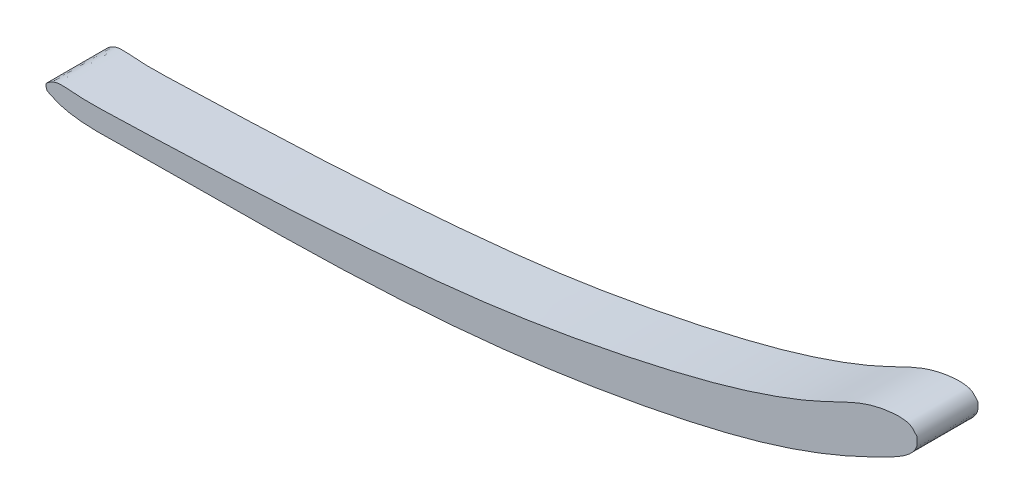
ISO-10303-21;
HEADER;
FILE_DESCRIPTION(('STEP AP214'),'2;1');
FILE_NAME('part.step','',(''),(''),'','','');
FILE_SCHEMA(('AUTOMOTIVE_DESIGN { 1 0 10303 214 1 1 1 1 }'));
ENDSEC;
DATA;
#1=APPLICATION_CONTEXT('core data for automotive mechanical design processes');
#2=APPLICATION_PROTOCOL_DEFINITION('international standard','automotive_design',2000,#1);
#3=PRODUCT_CONTEXT('',#1,'mechanical');
#4=PRODUCT('Part','Part','',(#3));
#5=PRODUCT_RELATED_PRODUCT_CATEGORY('part','',(#4));
#6=PRODUCT_DEFINITION_FORMATION('','',#4);
#7=PRODUCT_DEFINITION_CONTEXT('part definition',#1,'design');
#8=PRODUCT_DEFINITION('design','',#6,#7);
#9=PRODUCT_DEFINITION_SHAPE('','',#8);
#10=(LENGTH_UNIT() NAMED_UNIT(*) SI_UNIT(.MILLI.,.METRE.));
#11=(NAMED_UNIT(*) PLANE_ANGLE_UNIT() SI_UNIT($,.RADIAN.));
#12=(NAMED_UNIT(*) SI_UNIT($,.STERADIAN.) SOLID_ANGLE_UNIT());
#13=UNCERTAINTY_MEASURE_WITH_UNIT(LENGTH_MEASURE(1.E-05),#10,'distance_accuracy_value','');
#14=(GEOMETRIC_REPRESENTATION_CONTEXT(3) GLOBAL_UNCERTAINTY_ASSIGNED_CONTEXT((#13)) GLOBAL_UNIT_ASSIGNED_CONTEXT((#10,
#11,#12)) REPRESENTATION_CONTEXT('',''));
#15=CARTESIAN_POINT('',(0.,0.,0.));
#16=DIRECTION('',(0.,0.,1.));
#17=DIRECTION('',(1.,0.,0.));
#18=AXIS2_PLACEMENT_3D('',#15,#16,#17);
#19=CARTESIAN_POINT('',(57.6957577444344,0.,420.));
#20=CARTESIAN_POINT('',(57.6746414012089,0.0761931445320552,420.));
#21=CARTESIAN_POINT('',(57.6274217141167,0.139287646538477,420.));
#22=CARTESIAN_POINT('',(57.5278062502947,0.259245348111531,420.));
#23=CARTESIAN_POINT('',(57.4744601412395,0.316066928538222,420.));
#24=CARTESIAN_POINT('',(57.3178761778686,0.489613975625913,420.));
#25=CARTESIAN_POINT('',(57.2143321601057,0.607371960889752,420.));
#26=CARTESIAN_POINT('',(57.0419534165546,0.762929274472718,420.));
#27=CARTESIAN_POINT('',(56.9821556188157,0.811620179277411,420.));
#28=CARTESIAN_POINT('',(56.8540191391875,0.897453748194083,420.));
#29=CARTESIAN_POINT('',(56.7856673000739,0.934921988491516,420.));
#30=CARTESIAN_POINT('',(56.5710933485335,1.0323139720976,420.));
#31=CARTESIAN_POINT('',(56.4221530698055,1.07466842361997,420.));
#32=CARTESIAN_POINT('',(56.1185532725744,1.13746186876204,420.));
#33=CARTESIAN_POINT('',(55.9631484749642,1.15735441197284,420.));
#34=CARTESIAN_POINT('',(55.6541623711532,1.18490898338799,420.));
#35=CARTESIAN_POINT('',(55.499933159862,1.19242774943853,420.));
#36=CARTESIAN_POINT('',(55.0379487396865,1.19830323153564,420.));
#37=CARTESIAN_POINT('',(54.7308458332622,1.18118678860751,420.));
#38=CARTESIAN_POINT('',(53.8107801318468,1.10035203840922,420.));
#39=CARTESIAN_POINT('',(53.1969159507117,1.00199487463298,420.));
#40=CARTESIAN_POINT('',(51.9982074662134,0.74103268167805,420.));
#41=CARTESIAN_POINT('',(51.4107502462874,0.575923615079021,420.));
#42=CARTESIAN_POINT('',(49.6825721523972,-0.0189288058824733,420.));
#43=CARTESIAN_POINT('',(48.5733076952323,-0.540595442550057,420.));
#44=CARTESIAN_POINT('',(46.9158054695038,-1.34052992954325,420.));
#45=CARTESIAN_POINT('',(46.364059583972,-1.60908582738595,420.));
#46=CARTESIAN_POINT('',(45.2554415708234,-2.13321952309106,420.));
#47=CARTESIAN_POINT('',(44.6990824948914,-2.39009621319297,420.));
#48=CARTESIAN_POINT('',(43.0188262121015,-3.13242428546665,420.));
#49=CARTESIAN_POINT('',(41.8837758719624,-3.58963929557182,420.));
#50=CARTESIAN_POINT('',(39.5938800336473,-4.45395394162099,420.));
#51=CARTESIAN_POINT('',(38.4391684547898,-4.86139262091828,420.));
#52=CARTESIAN_POINT('',(36.115286837426,-5.63966551726278,420.));
#53=CARTESIAN_POINT('',(34.9450986183479,-6.00986609392981,420.));
#54=CARTESIAN_POINT('',(32.5932396107877,-6.70987611023413,420.));
#55=CARTESIAN_POINT('',(31.4118656948954,-7.04031532296198,420.));
#56=CARTESIAN_POINT('',(27.8553241106881,-7.9869993118657,420.));
#57=CARTESIAN_POINT('',(25.4689119757601,-8.56107323304506,420.));
#58=CARTESIAN_POINT('',(20.6829039933351,-9.63932774995169,420.));
#59=CARTESIAN_POINT('',(18.2816034079148,-10.1406158990431,420.));
#60=CARTESIAN_POINT('',(13.4653937283519,-11.0811265065462,420.));
#61=CARTESIAN_POINT('',(11.0513417463776,-11.5217958237208,420.));
#62=CARTESIAN_POINT('',(6.20943374346333,-12.3218519953654,420.));
#63=CARTESIAN_POINT('',(3.78227910066731,-12.6790594108758,420.));
#64=CARTESIAN_POINT('',(-1.08273692901209,-13.3056590635171,420.));
#65=CARTESIAN_POINT('',(-3.52086059824018,-13.5762734932468,420.));
#66=CARTESIAN_POINT('',(-8.40356823333585,-14.0640277008187,420.));
#67=CARTESIAN_POINT('',(-10.8467284049219,-14.2821836755774,420.));
#68=CARTESIAN_POINT('',(-15.7352199887654,-14.6875787836176,420.));
#69=CARTESIAN_POINT('',(-18.1806292972611,-14.8737087327868,420.));
#70=CARTESIAN_POINT('',(-23.0741814145337,-15.2070456337873,420.));
#71=CARTESIAN_POINT('',(-25.5224112050514,-15.353014030754,420.));
#72=CARTESIAN_POINT('',(-30.4215326213012,-15.6070482842384,420.));
#73=CARTESIAN_POINT('',(-32.8725049961423,-15.7154764878754,420.));
#74=CARTESIAN_POINT('',(-37.7753859557208,-15.9103570551025,420.));
#75=CARTESIAN_POINT('',(-40.22713154316,-16.0000792139787,420.));
#76=CARTESIAN_POINT('',(-43.9049051209464,-16.1300038568729,420.));
#77=CARTESIAN_POINT('',(-45.1308358864141,-16.1731831379567,420.));
#78=CARTESIAN_POINT('',(-46.9699473910788,-16.2314352414918,420.));
#79=CARTESIAN_POINT('',(-47.5830335446373,-16.2493305861844,420.));
#80=CARTESIAN_POINT('',(-48.8091900184935,-16.2854988647645,420.));
#81=CARTESIAN_POINT('',(-49.4222412947802,-16.3046000443136,420.));
#82=CARTESIAN_POINT('',(-50.6487266395471,-16.3283622769417,420.));
#83=CARTESIAN_POINT('',(-51.262061526244,-16.3319299714327,420.));
#84=CARTESIAN_POINT('',(-52.1806995325901,-16.3069432773214,420.));
#85=CARTESIAN_POINT('',(-52.4867538033821,-16.2943544118472,420.));
#86=CARTESIAN_POINT('',(-53.0984632247111,-16.2584427108008,420.));
#87=CARTESIAN_POINT('',(-53.4040578192765,-16.2334912783826,420.));
#88=CARTESIAN_POINT('',(-54.0152909350604,-16.1847697802497,420.));
#89=CARTESIAN_POINT('',(-54.3210021066969,-16.1632792052954,420.));
#90=CARTESIAN_POINT('',(-54.9317421736825,-16.1517270697823,420.));
#91=CARTESIAN_POINT('',(-55.2368924061291,-16.1581573651134,420.));
#92=CARTESIAN_POINT('',(-55.6933701718772,-16.237085690887,420.));
#93=CARTESIAN_POINT('',(-55.8436741134059,-16.2755379081933,420.));
#94=CARTESIAN_POINT('',(-56.1283548748484,-16.3847966950888,420.));
#95=CARTESIAN_POINT('',(-56.2639020689995,-16.4559645091384,420.));
#96=CARTESIAN_POINT('',(-56.5278577745638,-16.6156796890042,420.));
#97=CARTESIAN_POINT('',(-56.6551457432623,-16.7041810612361,420.));
#98=CARTESIAN_POINT('',(-56.8416119839124,-16.8412050874979,420.));
#99=CARTESIAN_POINT('',(-56.901377072477,-16.8914769552111,420.));
#100=CARTESIAN_POINT('',(-56.9805056627511,-17.029182386596,420.));
#101=CARTESIAN_POINT('',(-56.9986207783924,-17.1084585638813,420.));
#102=CARTESIAN_POINT('',(-56.9993079035974,-17.2654766876807,420.));
#103=CARTESIAN_POINT('',(-56.9873985351203,-17.3442698782522,420.));
#104=CARTESIAN_POINT('',(-56.9616189378734,-17.4999345500725,420.));
#105=CARTESIAN_POINT('',(-56.9438733532644,-17.578365282756,420.));
#106=CARTESIAN_POINT('',(-56.8920038283647,-17.6846006751835,420.));
#107=CARTESIAN_POINT('',(-56.8700323932881,-17.7186146620357,420.));
#108=CARTESIAN_POINT('',(-56.81639012874,-17.7756777829634,420.));
#109=CARTESIAN_POINT('',(-56.7845561554304,-17.7992612195086,420.));
#110=CARTESIAN_POINT('',(-56.6827207252406,-17.8603505642277,420.));
#111=CARTESIAN_POINT('',(-56.6086669096162,-17.888029613586,420.));
#112=CARTESIAN_POINT('',(-56.2429669745938,-18.0360990546933,420.));
#113=CARTESIAN_POINT('',(-55.9641130271261,-18.1859093693691,420.));
#114=CARTESIAN_POINT('',(-55.3849514723415,-18.4332090384683,420.));
#115=CARTESIAN_POINT('',(-55.0884644379033,-18.5284568950361,420.));
#116=CARTESIAN_POINT('',(-54.4882454513491,-18.6891578885438,420.));
#117=CARTESIAN_POINT('',(-54.1848064919,-18.7558159576512,420.));
#118=CARTESIAN_POINT('',(-53.2678571159981,-18.9285140227361,420.));
#119=CARTESIAN_POINT('',(-52.6451197202903,-19.0019950846019,420.));
#120=CARTESIAN_POINT('',(-51.4028776926679,-19.0891432962372,420.));
#121=CARTESIAN_POINT('',(-50.7810749727408,-19.1058926709598,420.));
#122=CARTESIAN_POINT('',(-49.5369433840839,-19.1186877772618,420.));
#123=CARTESIAN_POINT('',(-48.9145749264321,-19.1131757082583,420.));
#124=CARTESIAN_POINT('',(-47.6696906889994,-19.0963545318994,420.));
#125=CARTESIAN_POINT('',(-47.0471606864411,-19.0843899669186,420.));
#126=CARTESIAN_POINT('',(-45.1796907352222,-19.0476006754224,420.));
#127=CARTESIAN_POINT('',(-43.9347031516035,-19.0237113894058,420.));
#128=CARTESIAN_POINT('',(-40.1994778459541,-18.9739999742624,420.));
#129=CARTESIAN_POINT('',(-37.709037079459,-18.9652979108906,420.));
#130=CARTESIAN_POINT('',(-32.7281929337443,-18.9440401609455,420.));
#131=CARTESIAN_POINT('',(-30.2377909283807,-18.93237745251,420.));
#132=CARTESIAN_POINT('',(-25.2577101458844,-18.8717928961891,420.));
#133=CARTESIAN_POINT('',(-22.7680024710597,-18.8243597943079,420.));
#134=CARTESIAN_POINT('',(-17.7895470689348,-18.6800391899081,420.));
#135=CARTESIAN_POINT('',(-15.3004488025836,-18.5820967938186,420.));
#136=CARTESIAN_POINT('',(-7.83755799883329,-18.2024773980687,420.));
#137=CARTESIAN_POINT('',(-2.86787856540084,-17.8302064505348,420.));
#138=CARTESIAN_POINT('',(7.03841722166944,-16.7785361359492,420.));
#139=CARTESIAN_POINT('',(11.9751464377186,-16.0946911351637,420.));
#140=CARTESIAN_POINT('',(19.3431192214291,-14.8494266089367,420.));
#141=CARTESIAN_POINT('',(21.7932012970811,-14.3988814479664,420.));
#142=CARTESIAN_POINT('',(26.675565533546,-13.4174676359961,420.));
#143=CARTESIAN_POINT('',(29.108533784796,-12.8871149270979,420.));
#144=CARTESIAN_POINT('',(33.9508458879289,-11.7123818189012,420.));
#145=CARTESIAN_POINT('',(36.3566069581641,-11.0678218257028,420.));
#146=CARTESIAN_POINT('',(41.117384476519,-9.60340414878083,420.));
#147=CARTESIAN_POINT('',(43.4714594317425,-8.78096854916394,420.));
#148=CARTESIAN_POINT('',(48.0994642159188,-6.93421360664578,420.));
#149=CARTESIAN_POINT('',(50.3726975403092,-5.90791847454247,420.));
#150=CARTESIAN_POINT('',(53.1661497475572,-4.5295420730144,420.));
#151=CARTESIAN_POINT('',(53.7225728387395,-4.24892534042667,420.));
#152=CARTESIAN_POINT('',(54.5474746593948,-3.8100406966462,420.));
#153=CARTESIAN_POINT('',(54.8205306259705,-3.66017122559004,420.));
#154=CARTESIAN_POINT('',(55.3598383695193,-3.34770686206323,420.));
#155=CARTESIAN_POINT('',(55.6258242848513,-3.18621698184696,420.));
#156=CARTESIAN_POINT('',(56.1414939696677,-2.84019354767875,420.));
#157=CARTESIAN_POINT('',(56.3911375039245,-2.65557339350969,420.));
#158=CARTESIAN_POINT('',(56.8615703631192,-2.24544190304035,420.));
#159=CARTESIAN_POINT('',(57.0798428733354,-2.01951832233499,420.));
#160=CARTESIAN_POINT('',(57.3595445114165,-1.64437041381127,420.));
#161=CARTESIAN_POINT('',(57.4459902945641,-1.51202154284349,420.));
#162=CARTESIAN_POINT('',(57.587831806813,-1.23463483675595,420.));
#163=CARTESIAN_POINT('',(57.6451020782033,-1.08689582757548,420.));
#164=CARTESIAN_POINT('',(57.7014154524666,-0.778664103891907,420.));
#165=CARTESIAN_POINT('',(57.6987354337193,-0.622532108235457,420.));
#166=CARTESIAN_POINT('',(57.6984035045225,-0.388575246244582,420.));
#167=CARTESIAN_POINT('',(57.7017070940338,-0.310814006090204,420.));
#168=CARTESIAN_POINT('',(57.709840131705,-0.155240517730859,420.));
#169=CARTESIAN_POINT('',(57.7168740876599,-0.0761931445320274,420.));
#170=CARTESIAN_POINT('',(57.6957577444344,0.,420.));
#171=B_SPLINE_CURVE_WITH_KNOTS('',3,(#19,#20,#21,#22,#23,#24,#25,#26,#27,#28,#29,#30,#31,#32,
#33,#34,#35,#36,#37,#38,#39,#40,#41,#42,#43,#44,#45,#46,#47,#48,#49,#50,#51,#52,#53,#54,#55,#56,
#57,#58,#59,#60,#61,#62,#63,#64,#65,#66,#67,#68,#69,#70,#71,#72,#73,#74,#75,#76,#77,#78,#79,#80,
#81,#82,#83,#84,#85,#86,#87,#88,#89,#90,#91,#92,#93,#94,#95,#96,#97,#98,#99,#100,#101,#102,#103,
#104,#105,#106,#107,#108,#109,#110,#111,#112,#113,#114,#115,#116,#117,#118,#119,#120,#121,#122,
#123,#124,#125,#126,#127,#128,#129,#130,#131,#132,#133,#134,#135,#136,#137,#138,#139,#140,#141,
#142,#143,#144,#145,#146,#147,#148,#149,#150,#151,#152,#153,#154,#155,#156,#157,#158,#159,#160,
#161,#162,#163,#164,#165,#166,#167,#168,#169,#170),.UNSPECIFIED.,.T.,.F.,(4,2,2,2,2,2,2,2,2,2,2,
2,2,2,2,2,2,2,2,2,2,2,2,2,2,2,2,2,2,2,2,2,2,2,2,2,2,2,2,2,2,2,2,2,2,2,2,2,2,2,2,2,2,2,2,2,2,2,2,
2,2,2,2,2,2,2,2,2,2,2,2,2,2,2,2,4),(0.,0.000976562499999942,0.00195312499999988,
0.00390624999999983,0.00488281249999983,0.00585937499999984,0.00781249999999992,
0.00976562500000001,0.0117187500000001,0.0156250000000002,0.0234375000000004,0.0312500000000007,
0.0468750000000013,0.0546875000000016,0.0625000000000018,0.0781250000000022,0.0937500000000027,
0.109375000000003,0.125000000000004,0.156250000000004,0.187500000000005,0.218750000000006,
0.250000000000007,0.281250000000008,0.312500000000009,0.34375000000001,0.375000000000011,
0.406250000000012,0.437500000000013,0.453125000000013,0.460937500000014,0.468750000000014,
0.476562500000014,0.480468750000014,0.484375000000014,0.488281250000014,0.492187500000014,
0.494140625000014,0.496093750000014,0.498046875000015,0.499023437500015,0.500000000000015,
0.500976562500015,0.501953125000015,0.502441406250015,0.502929687500015,0.503906250000015,
0.507812500000015,0.511718750000015,0.515625000000015,0.523437500000015,0.531250000000014,
0.539062500000014,0.546875000000014,0.562500000000014,0.593750000000013,0.625000000000012,
0.656250000000011,0.68750000000001,0.750000000000008,0.812500000000006,0.843750000000005,
0.875000000000004,0.906250000000003,0.937500000000002,0.968750000000001,0.976562500000001,
0.980468750000001,0.984375000000001,0.988281250000001,0.9921875,0.994140625,0.99609375,
0.998046875,0.9990234375,1.),.UNSPECIFIED.);
#172=DIRECTION('',(0.,0.,-1.));
#173=VECTOR('',#172,1.);
#174=SURFACE_OF_LINEAR_EXTRUSION('',#171,#173);
#175=CARTESIAN_POINT('',(57.6957577444344,0.,420.));
#176=CARTESIAN_POINT('',(57.7168740876599,-0.0761931445320274,420.));
#177=CARTESIAN_POINT('',(57.709840131705,-0.155240517730859,420.));
#178=CARTESIAN_POINT('',(57.7017070940338,-0.310814006090204,420.));
#179=CARTESIAN_POINT('',(57.6984035045225,-0.388575246244582,420.));
#180=CARTESIAN_POINT('',(57.6987354337193,-0.622532108235457,420.));
#181=CARTESIAN_POINT('',(57.7014154524666,-0.778664103891907,420.));
#182=CARTESIAN_POINT('',(57.6451020782033,-1.08689582757548,420.));
#183=CARTESIAN_POINT('',(57.587831806813,-1.23463483675595,420.));
#184=CARTESIAN_POINT('',(57.4459902945641,-1.51202154284349,420.));
#185=CARTESIAN_POINT('',(57.3595445114165,-1.64437041381127,420.));
#186=CARTESIAN_POINT('',(57.0798428733354,-2.01951832233499,420.));
#187=CARTESIAN_POINT('',(56.8615703631192,-2.24544190304035,420.));
#188=CARTESIAN_POINT('',(56.3911375039245,-2.65557339350969,420.));
#189=CARTESIAN_POINT('',(56.1414939696677,-2.84019354767875,420.));
#190=CARTESIAN_POINT('',(55.6258242848513,-3.18621698184696,420.));
#191=CARTESIAN_POINT('',(55.3598383695193,-3.34770686206323,420.));
#192=CARTESIAN_POINT('',(54.8205306259705,-3.66017122559004,420.));
#193=CARTESIAN_POINT('',(54.5474746593948,-3.8100406966462,420.));
#194=CARTESIAN_POINT('',(53.7225728387395,-4.24892534042667,420.));
#195=CARTESIAN_POINT('',(53.1661497475572,-4.5295420730144,420.));
#196=CARTESIAN_POINT('',(50.3726975403092,-5.90791847454247,420.));
#197=CARTESIAN_POINT('',(48.0994642159188,-6.93421360664578,420.));
#198=CARTESIAN_POINT('',(43.4714594317425,-8.78096854916394,420.));
#199=CARTESIAN_POINT('',(41.117384476519,-9.60340414878083,420.));
#200=CARTESIAN_POINT('',(36.3566069581641,-11.0678218257028,420.));
#201=CARTESIAN_POINT('',(33.9508458879289,-11.7123818189012,420.));
#202=CARTESIAN_POINT('',(29.108533784796,-12.8871149270979,420.));
#203=CARTESIAN_POINT('',(26.675565533546,-13.4174676359961,420.));
#204=CARTESIAN_POINT('',(21.7932012970811,-14.3988814479664,420.));
#205=CARTESIAN_POINT('',(19.3431192214291,-14.8494266089367,420.));
#206=CARTESIAN_POINT('',(11.9751464377186,-16.0946911351637,420.));
#207=CARTESIAN_POINT('',(7.03841722166944,-16.7785361359492,420.));
#208=CARTESIAN_POINT('',(-2.86787856540084,-17.8302064505348,420.));
#209=CARTESIAN_POINT('',(-7.83755799883329,-18.2024773980687,420.));
#210=CARTESIAN_POINT('',(-15.3004488025836,-18.5820967938186,420.));
#211=CARTESIAN_POINT('',(-17.7895470689348,-18.6800391899081,420.));
#212=CARTESIAN_POINT('',(-22.7680024710597,-18.8243597943079,420.));
#213=CARTESIAN_POINT('',(-25.2577101458844,-18.8717928961891,420.));
#214=CARTESIAN_POINT('',(-30.2377909283807,-18.93237745251,420.));
#215=CARTESIAN_POINT('',(-32.7281929337443,-18.9440401609455,420.));
#216=CARTESIAN_POINT('',(-37.709037079459,-18.9652979108906,420.));
#217=CARTESIAN_POINT('',(-40.1994778459541,-18.9739999742624,420.));
#218=CARTESIAN_POINT('',(-43.9347031516035,-19.0237113894058,420.));
#219=CARTESIAN_POINT('',(-45.1796907352222,-19.0476006754224,420.));
#220=CARTESIAN_POINT('',(-47.0471606864411,-19.0843899669186,420.));
#221=CARTESIAN_POINT('',(-47.6696906889994,-19.0963545318994,420.));
#222=CARTESIAN_POINT('',(-48.9145749264321,-19.1131757082583,420.));
#223=CARTESIAN_POINT('',(-49.5369433840839,-19.1186877772618,420.));
#224=CARTESIAN_POINT('',(-50.7810749727408,-19.1058926709598,420.));
#225=CARTESIAN_POINT('',(-51.4028776926679,-19.0891432962372,420.));
#226=CARTESIAN_POINT('',(-52.6451197202903,-19.0019950846019,420.));
#227=CARTESIAN_POINT('',(-53.2678571159981,-18.9285140227361,420.));
#228=CARTESIAN_POINT('',(-54.1848064919,-18.7558159576512,420.));
#229=CARTESIAN_POINT('',(-54.4882454513491,-18.6891578885438,420.));
#230=CARTESIAN_POINT('',(-55.0884644379033,-18.5284568950361,420.));
#231=CARTESIAN_POINT('',(-55.3849514723415,-18.4332090384683,420.));
#232=CARTESIAN_POINT('',(-55.9641130271261,-18.1859093693691,420.));
#233=CARTESIAN_POINT('',(-56.2429669745938,-18.0360990546933,420.));
#234=CARTESIAN_POINT('',(-56.6086669096162,-17.888029613586,420.));
#235=CARTESIAN_POINT('',(-56.6827207252406,-17.8603505642277,420.));
#236=CARTESIAN_POINT('',(-56.7845561554304,-17.7992612195086,420.));
#237=CARTESIAN_POINT('',(-56.81639012874,-17.7756777829634,420.));
#238=CARTESIAN_POINT('',(-56.8700323932881,-17.7186146620357,420.));
#239=CARTESIAN_POINT('',(-56.8920038283647,-17.6846006751835,420.));
#240=CARTESIAN_POINT('',(-56.9438733532644,-17.578365282756,420.));
#241=CARTESIAN_POINT('',(-56.9616189378734,-17.4999345500725,420.));
#242=CARTESIAN_POINT('',(-56.9873985351203,-17.3442698782522,420.));
#243=CARTESIAN_POINT('',(-56.9993079035974,-17.2654766876807,420.));
#244=CARTESIAN_POINT('',(-56.9986207783924,-17.1084585638813,420.));
#245=CARTESIAN_POINT('',(-56.9805056627511,-17.029182386596,420.));
#246=CARTESIAN_POINT('',(-56.901377072477,-16.8914769552111,420.));
#247=CARTESIAN_POINT('',(-56.8416119839124,-16.8412050874979,420.));
#248=CARTESIAN_POINT('',(-56.6551457432623,-16.7041810612361,420.));
#249=CARTESIAN_POINT('',(-56.5278577745638,-16.6156796890042,420.));
#250=CARTESIAN_POINT('',(-56.2639020689995,-16.4559645091384,420.));
#251=CARTESIAN_POINT('',(-56.1283548748484,-16.3847966950888,420.));
#252=CARTESIAN_POINT('',(-55.8436741134059,-16.2755379081933,420.));
#253=CARTESIAN_POINT('',(-55.6933701718772,-16.237085690887,420.));
#254=CARTESIAN_POINT('',(-55.2368924061291,-16.1581573651134,420.));
#255=CARTESIAN_POINT('',(-54.9317421736825,-16.1517270697823,420.));
#256=CARTESIAN_POINT('',(-54.3210021066969,-16.1632792052954,420.));
#257=CARTESIAN_POINT('',(-54.0152909350604,-16.1847697802497,420.));
#258=CARTESIAN_POINT('',(-53.4040578192765,-16.2334912783826,420.));
#259=CARTESIAN_POINT('',(-53.0984632247111,-16.2584427108008,420.));
#260=CARTESIAN_POINT('',(-52.4867538033821,-16.2943544118472,420.));
#261=CARTESIAN_POINT('',(-52.1806995325901,-16.3069432773214,420.));
#262=CARTESIAN_POINT('',(-51.262061526244,-16.3319299714327,420.));
#263=CARTESIAN_POINT('',(-50.6487266395471,-16.3283622769417,420.));
#264=CARTESIAN_POINT('',(-49.4222412947802,-16.3046000443136,420.));
#265=CARTESIAN_POINT('',(-48.8091900184935,-16.2854988647645,420.));
#266=CARTESIAN_POINT('',(-47.5830335446373,-16.2493305861844,420.));
#267=CARTESIAN_POINT('',(-46.9699473910788,-16.2314352414918,420.));
#268=CARTESIAN_POINT('',(-45.1308358864141,-16.1731831379567,420.));
#269=CARTESIAN_POINT('',(-43.9049051209464,-16.1300038568729,420.));
#270=CARTESIAN_POINT('',(-40.22713154316,-16.0000792139787,420.));
#271=CARTESIAN_POINT('',(-37.7753859557208,-15.9103570551025,420.));
#272=CARTESIAN_POINT('',(-32.8725049961423,-15.7154764878754,420.));
#273=CARTESIAN_POINT('',(-30.4215326213012,-15.6070482842384,420.));
#274=CARTESIAN_POINT('',(-25.5224112050514,-15.353014030754,420.));
#275=CARTESIAN_POINT('',(-23.0741814145337,-15.2070456337873,420.));
#276=CARTESIAN_POINT('',(-18.1806292972611,-14.8737087327868,420.));
#277=CARTESIAN_POINT('',(-15.7352199887654,-14.6875787836176,420.));
#278=CARTESIAN_POINT('',(-10.8467284049219,-14.2821836755774,420.));
#279=CARTESIAN_POINT('',(-8.40356823333585,-14.0640277008187,420.));
#280=CARTESIAN_POINT('',(-3.52086059824018,-13.5762734932468,420.));
#281=CARTESIAN_POINT('',(-1.08273692901209,-13.3056590635171,420.));
#282=CARTESIAN_POINT('',(3.78227910066731,-12.6790594108758,420.));
#283=CARTESIAN_POINT('',(6.20943374346333,-12.3218519953654,420.));
#284=CARTESIAN_POINT('',(11.0513417463776,-11.5217958237208,420.));
#285=CARTESIAN_POINT('',(13.4653937283519,-11.0811265065462,420.));
#286=CARTESIAN_POINT('',(18.2816034079148,-10.1406158990431,420.));
#287=CARTESIAN_POINT('',(20.6829039933351,-9.63932774995169,420.));
#288=CARTESIAN_POINT('',(25.4689119757601,-8.56107323304506,420.));
#289=CARTESIAN_POINT('',(27.8553241106881,-7.9869993118657,420.));
#290=CARTESIAN_POINT('',(31.4118656948954,-7.04031532296198,420.));
#291=CARTESIAN_POINT('',(32.5932396107877,-6.70987611023413,420.));
#292=CARTESIAN_POINT('',(34.9450986183479,-6.00986609392981,420.));
#293=CARTESIAN_POINT('',(36.115286837426,-5.63966551726278,420.));
#294=CARTESIAN_POINT('',(38.4391684547898,-4.86139262091828,420.));
#295=CARTESIAN_POINT('',(39.5938800336473,-4.45395394162099,420.));
#296=CARTESIAN_POINT('',(41.8837758719624,-3.58963929557182,420.));
#297=CARTESIAN_POINT('',(43.0188262121015,-3.13242428546665,420.));
#298=CARTESIAN_POINT('',(44.6990824948914,-2.39009621319297,420.));
#299=CARTESIAN_POINT('',(45.2554415708234,-2.13321952309106,420.));
#300=CARTESIAN_POINT('',(46.364059583972,-1.60908582738595,420.));
#301=CARTESIAN_POINT('',(46.9158054695038,-1.34052992954325,420.));
#302=CARTESIAN_POINT('',(48.5733076952323,-0.540595442550057,420.));
#303=CARTESIAN_POINT('',(49.6825721523972,-0.0189288058824733,420.));
#304=CARTESIAN_POINT('',(51.4107502462874,0.575923615079021,420.));
#305=CARTESIAN_POINT('',(51.9982074662134,0.74103268167805,420.));
#306=CARTESIAN_POINT('',(53.1969159507117,1.00199487463298,420.));
#307=CARTESIAN_POINT('',(53.8107801318468,1.10035203840922,420.));
#308=CARTESIAN_POINT('',(54.7308458332622,1.18118678860751,420.));
#309=CARTESIAN_POINT('',(55.0379487396865,1.19830323153564,420.));
#310=CARTESIAN_POINT('',(55.499933159862,1.19242774943853,420.));
#311=CARTESIAN_POINT('',(55.6541623711532,1.18490898338799,420.));
#312=CARTESIAN_POINT('',(55.9631484749642,1.15735441197284,420.));
#313=CARTESIAN_POINT('',(56.1185532725744,1.13746186876204,420.));
#314=CARTESIAN_POINT('',(56.4221530698055,1.07466842361997,420.));
#315=CARTESIAN_POINT('',(56.5710933485335,1.0323139720976,420.));
#316=CARTESIAN_POINT('',(56.7856673000739,0.934921988491516,420.));
#317=CARTESIAN_POINT('',(56.8540191391875,0.897453748194083,420.));
#318=CARTESIAN_POINT('',(56.9821556188157,0.811620179277411,420.));
#319=CARTESIAN_POINT('',(57.0419534165546,0.762929274472718,420.));
#320=CARTESIAN_POINT('',(57.2143321601057,0.607371960889752,420.));
#321=CARTESIAN_POINT('',(57.3178761778686,0.489613975625913,420.));
#322=CARTESIAN_POINT('',(57.4744601412395,0.316066928538222,420.));
#323=CARTESIAN_POINT('',(57.5278062502947,0.259245348111531,420.));
#324=CARTESIAN_POINT('',(57.6274217141167,0.139287646538477,420.));
#325=CARTESIAN_POINT('',(57.6746414012089,0.0761931445320552,420.));
#326=CARTESIAN_POINT('',(57.6957577444344,0.,420.));
#327=B_SPLINE_CURVE_WITH_KNOTS('',3,(#175,#176,#177,#178,#179,#180,#181,#182,#183,#184,#185,
#186,#187,#188,#189,#190,#191,#192,#193,#194,#195,#196,#197,#198,#199,#200,#201,#202,#203,#204,
#205,#206,#207,#208,#209,#210,#211,#212,#213,#214,#215,#216,#217,#218,#219,#220,#221,#222,#223,
#224,#225,#226,#227,#228,#229,#230,#231,#232,#233,#234,#235,#236,#237,#238,#239,#240,#241,#242,
#243,#244,#245,#246,#247,#248,#249,#250,#251,#252,#253,#254,#255,#256,#257,#258,#259,#260,#261,
#262,#263,#264,#265,#266,#267,#268,#269,#270,#271,#272,#273,#274,#275,#276,#277,#278,#279,#280,
#281,#282,#283,#284,#285,#286,#287,#288,#289,#290,#291,#292,#293,#294,#295,#296,#297,#298,#299,
#300,#301,#302,#303,#304,#305,#306,#307,#308,#309,#310,#311,#312,#313,#314,#315,#316,#317,#318,
#319,#320,#321,#322,#323,#324,#325,#326),.UNSPECIFIED.,.T.,.F.,(4,2,2,2,2,2,2,2,2,2,2,2,2,2,2,2,
2,2,2,2,2,2,2,2,2,2,2,2,2,2,2,2,2,2,2,2,2,2,2,2,2,2,2,2,2,2,2,2,2,2,2,2,2,2,2,2,2,2,2,2,2,2,2,2,
2,2,2,2,2,2,2,2,2,2,2,4),(0.,0.000976562499999889,0.00195312499999989,0.00390624999999978,
0.00585937499999967,0.00781249999999956,0.0117187499999994,0.0156249999999993,
0.0195312499999992,0.0234374999999991,0.0312499999999988,0.0624999999999979,0.0937499999999969,
0.124999999999996,0.156249999999995,0.187499999999994,0.249999999999992,0.31249999999999,
0.343749999999989,0.374999999999988,0.406249999999987,0.437499999999986,0.453124999999986,
0.460937499999986,0.468749999999986,0.476562499999985,0.484374999999985,0.488281249999985,
0.492187499999985,0.496093749999985,0.497070312499985,0.497558593749985,0.498046874999985,
0.499023437499985,0.499999999999985,0.500976562499985,0.501953124999985,0.503906249999986,
0.505859374999986,0.507812499999986,0.511718749999986,0.515624999999986,0.519531249999986,
0.523437499999986,0.531249999999986,0.539062499999986,0.546874999999987,0.562499999999987,
0.593749999999988,0.624999999999989,0.65624999999999,0.687499999999991,0.718749999999992,
0.749999999999993,0.781249999999994,0.812499999999995,0.843749999999996,0.874999999999996,
0.890624999999997,0.906249999999997,0.921874999999998,0.937499999999998,0.945312499999998,
0.953124999999999,0.968749999999999,0.9765625,0.984375,0.98828125,0.990234375,0.9921875,
0.994140625,0.9951171875,0.99609375,0.998046875,0.9990234375,1.),.UNSPECIFIED.);
#328=CARTESIAN_POINT('',(57.6957577444344,0.,420.));
#329=VERTEX_POINT('',#328);
#330=EDGE_CURVE('E10',#329,#329,#327,.F.);
#331=ORIENTED_EDGE('',*,*,#330,.F.);
#332=EDGE_LOOP('',(#331));
#333=FACE_BOUND('',#332,.T.);
#334=CARTESIAN_POINT('',(57.6957577444344,0.,412.000000000001));
#335=CARTESIAN_POINT('',(57.6746414012089,0.0761931445320552,412.000000000001));
#336=CARTESIAN_POINT('',(57.6274217141167,0.139287646538477,412.000000000001));
#337=CARTESIAN_POINT('',(57.5278062502947,0.259245348111531,412.000000000001));
#338=CARTESIAN_POINT('',(57.4744601412395,0.316066928538222,412.000000000001));
#339=CARTESIAN_POINT('',(57.3178761778686,0.489613975625913,412.000000000001));
#340=CARTESIAN_POINT('',(57.2143321601057,0.607371960889752,412.000000000001));
#341=CARTESIAN_POINT('',(57.0419534165546,0.762929274472718,412.000000000001));
#342=CARTESIAN_POINT('',(56.9821556188157,0.811620179277411,412.000000000001));
#343=CARTESIAN_POINT('',(56.8540191391875,0.897453748194083,412.000000000001));
#344=CARTESIAN_POINT('',(56.7856673000739,0.934921988491516,412.000000000001));
#345=CARTESIAN_POINT('',(56.5710933485335,1.0323139720976,412.000000000001));
#346=CARTESIAN_POINT('',(56.4221530698055,1.07466842361997,412.000000000001));
#347=CARTESIAN_POINT('',(56.1185532725744,1.13746186876204,412.000000000001));
#348=CARTESIAN_POINT('',(55.9631484749642,1.15735441197284,412.000000000001));
#349=CARTESIAN_POINT('',(55.6541623711532,1.18490898338799,412.000000000001));
#350=CARTESIAN_POINT('',(55.499933159862,1.19242774943853,412.000000000001));
#351=CARTESIAN_POINT('',(55.0379487396865,1.19830323153564,412.000000000001));
#352=CARTESIAN_POINT('',(54.7308458332622,1.18118678860751,412.000000000001));
#353=CARTESIAN_POINT('',(53.8107801318468,1.10035203840922,412.000000000001));
#354=CARTESIAN_POINT('',(53.1969159507117,1.00199487463298,412.000000000001));
#355=CARTESIAN_POINT('',(51.9982074662134,0.74103268167805,412.000000000001));
#356=CARTESIAN_POINT('',(51.4107502462874,0.575923615079021,412.000000000001));
#357=CARTESIAN_POINT('',(49.6825721523972,-0.0189288058824733,412.000000000001));
#358=CARTESIAN_POINT('',(48.5733076952323,-0.540595442550057,412.000000000001));
#359=CARTESIAN_POINT('',(46.9158054695038,-1.34052992954325,412.000000000001));
#360=CARTESIAN_POINT('',(46.364059583972,-1.60908582738595,412.000000000001));
#361=CARTESIAN_POINT('',(45.2554415708234,-2.13321952309106,412.000000000001));
#362=CARTESIAN_POINT('',(44.6990824948914,-2.39009621319297,412.000000000001));
#363=CARTESIAN_POINT('',(43.0188262121015,-3.13242428546665,412.000000000001));
#364=CARTESIAN_POINT('',(41.8837758719624,-3.58963929557182,412.000000000001));
#365=CARTESIAN_POINT('',(39.5938800336473,-4.45395394162099,412.000000000001));
#366=CARTESIAN_POINT('',(38.4391684547898,-4.86139262091828,412.000000000001));
#367=CARTESIAN_POINT('',(36.115286837426,-5.63966551726278,412.000000000001));
#368=CARTESIAN_POINT('',(34.9450986183479,-6.00986609392981,412.000000000001));
#369=CARTESIAN_POINT('',(32.5932396107877,-6.70987611023413,412.000000000001));
#370=CARTESIAN_POINT('',(31.4118656948954,-7.04031532296198,412.000000000001));
#371=CARTESIAN_POINT('',(27.8553241106881,-7.9869993118657,412.000000000001));
#372=CARTESIAN_POINT('',(25.4689119757601,-8.56107323304506,412.000000000001));
#373=CARTESIAN_POINT('',(20.6829039933351,-9.63932774995169,412.000000000001));
#374=CARTESIAN_POINT('',(18.2816034079148,-10.1406158990431,412.000000000001));
#375=CARTESIAN_POINT('',(13.4653937283519,-11.0811265065462,412.000000000001));
#376=CARTESIAN_POINT('',(11.0513417463776,-11.5217958237208,412.000000000001));
#377=CARTESIAN_POINT('',(6.20943374346333,-12.3218519953654,412.000000000001));
#378=CARTESIAN_POINT('',(3.78227910066731,-12.6790594108758,412.000000000001));
#379=CARTESIAN_POINT('',(-1.08273692901209,-13.3056590635171,412.000000000001));
#380=CARTESIAN_POINT('',(-3.52086059824018,-13.5762734932468,412.000000000001));
#381=CARTESIAN_POINT('',(-8.40356823333585,-14.0640277008187,412.000000000001));
#382=CARTESIAN_POINT('',(-10.8467284049219,-14.2821836755774,412.000000000001));
#383=CARTESIAN_POINT('',(-15.7352199887654,-14.6875787836176,412.000000000001));
#384=CARTESIAN_POINT('',(-18.1806292972611,-14.8737087327868,412.000000000001));
#385=CARTESIAN_POINT('',(-23.0741814145337,-15.2070456337873,412.000000000001));
#386=CARTESIAN_POINT('',(-25.5224112050514,-15.353014030754,412.000000000001));
#387=CARTESIAN_POINT('',(-30.4215326213012,-15.6070482842384,412.000000000001));
#388=CARTESIAN_POINT('',(-32.8725049961423,-15.7154764878754,412.000000000001));
#389=CARTESIAN_POINT('',(-37.7753859557208,-15.9103570551025,412.000000000001));
#390=CARTESIAN_POINT('',(-40.22713154316,-16.0000792139787,412.000000000001));
#391=CARTESIAN_POINT('',(-43.9049051209464,-16.1300038568729,412.000000000001));
#392=CARTESIAN_POINT('',(-45.1308358864141,-16.1731831379567,412.000000000001));
#393=CARTESIAN_POINT('',(-46.9699473910788,-16.2314352414918,412.000000000001));
#394=CARTESIAN_POINT('',(-47.5830335446373,-16.2493305861844,412.000000000001));
#395=CARTESIAN_POINT('',(-48.8091900184935,-16.2854988647645,412.000000000001));
#396=CARTESIAN_POINT('',(-49.4222412947802,-16.3046000443136,412.000000000001));
#397=CARTESIAN_POINT('',(-50.6487266395471,-16.3283622769417,412.000000000001));
#398=CARTESIAN_POINT('',(-51.262061526244,-16.3319299714327,412.000000000001));
#399=CARTESIAN_POINT('',(-52.1806995325901,-16.3069432773214,412.000000000001));
#400=CARTESIAN_POINT('',(-52.4867538033821,-16.2943544118472,412.000000000001));
#401=CARTESIAN_POINT('',(-53.0984632247111,-16.2584427108008,412.000000000001));
#402=CARTESIAN_POINT('',(-53.4040578192765,-16.2334912783826,412.000000000001));
#403=CARTESIAN_POINT('',(-54.0152909350604,-16.1847697802497,412.000000000001));
#404=CARTESIAN_POINT('',(-54.3210021066969,-16.1632792052954,412.000000000001));
#405=CARTESIAN_POINT('',(-54.9317421736825,-16.1517270697823,412.000000000001));
#406=CARTESIAN_POINT('',(-55.2368924061291,-16.1581573651134,412.000000000001));
#407=CARTESIAN_POINT('',(-55.6933701718772,-16.237085690887,412.000000000001));
#408=CARTESIAN_POINT('',(-55.8436741134059,-16.2755379081933,412.000000000001));
#409=CARTESIAN_POINT('',(-56.1283548748484,-16.3847966950888,412.000000000001));
#410=CARTESIAN_POINT('',(-56.2639020689995,-16.4559645091384,412.000000000001));
#411=CARTESIAN_POINT('',(-56.5278577745638,-16.6156796890042,412.000000000001));
#412=CARTESIAN_POINT('',(-56.6551457432623,-16.7041810612361,412.000000000001));
#413=CARTESIAN_POINT('',(-56.8416119839124,-16.8412050874979,412.000000000001));
#414=CARTESIAN_POINT('',(-56.901377072477,-16.8914769552111,412.000000000001));
#415=CARTESIAN_POINT('',(-56.9805056627511,-17.029182386596,412.000000000001));
#416=CARTESIAN_POINT('',(-56.9986207783924,-17.1084585638813,412.000000000001));
#417=CARTESIAN_POINT('',(-56.9993079035974,-17.2654766876807,412.000000000001));
#418=CARTESIAN_POINT('',(-56.9873985351203,-17.3442698782522,412.000000000001));
#419=CARTESIAN_POINT('',(-56.9616189378734,-17.4999345500725,412.000000000001));
#420=CARTESIAN_POINT('',(-56.9438733532644,-17.578365282756,412.000000000001));
#421=CARTESIAN_POINT('',(-56.8920038283647,-17.6846006751835,412.000000000001));
#422=CARTESIAN_POINT('',(-56.8700323932881,-17.7186146620357,412.000000000001));
#423=CARTESIAN_POINT('',(-56.81639012874,-17.7756777829634,412.000000000001));
#424=CARTESIAN_POINT('',(-56.7845561554304,-17.7992612195086,412.000000000001));
#425=CARTESIAN_POINT('',(-56.6827207252406,-17.8603505642277,412.000000000001));
#426=CARTESIAN_POINT('',(-56.6086669096162,-17.888029613586,412.000000000001));
#427=CARTESIAN_POINT('',(-56.2429669745938,-18.0360990546933,412.000000000001));
#428=CARTESIAN_POINT('',(-55.9641130271261,-18.1859093693691,412.000000000001));
#429=CARTESIAN_POINT('',(-55.3849514723415,-18.4332090384683,412.000000000001));
#430=CARTESIAN_POINT('',(-55.0884644379033,-18.5284568950361,412.000000000001));
#431=CARTESIAN_POINT('',(-54.4882454513491,-18.6891578885438,412.000000000001));
#432=CARTESIAN_POINT('',(-54.1848064919,-18.7558159576512,412.000000000001));
#433=CARTESIAN_POINT('',(-53.2678571159981,-18.9285140227361,412.000000000001));
#434=CARTESIAN_POINT('',(-52.6451197202903,-19.0019950846019,412.000000000001));
#435=CARTESIAN_POINT('',(-51.4028776926679,-19.0891432962372,412.000000000001));
#436=CARTESIAN_POINT('',(-50.7810749727408,-19.1058926709598,412.000000000001));
#437=CARTESIAN_POINT('',(-49.5369433840839,-19.1186877772618,412.000000000001));
#438=CARTESIAN_POINT('',(-48.9145749264321,-19.1131757082583,412.000000000001));
#439=CARTESIAN_POINT('',(-47.6696906889994,-19.0963545318994,412.000000000001));
#440=CARTESIAN_POINT('',(-47.0471606864411,-19.0843899669186,412.000000000001));
#441=CARTESIAN_POINT('',(-45.1796907352222,-19.0476006754224,412.000000000001));
#442=CARTESIAN_POINT('',(-43.9347031516035,-19.0237113894058,412.000000000001));
#443=CARTESIAN_POINT('',(-40.1994778459541,-18.9739999742624,412.000000000001));
#444=CARTESIAN_POINT('',(-37.709037079459,-18.9652979108906,412.000000000001));
#445=CARTESIAN_POINT('',(-32.7281929337443,-18.9440401609455,412.000000000001));
#446=CARTESIAN_POINT('',(-30.2377909283807,-18.93237745251,412.000000000001));
#447=CARTESIAN_POINT('',(-25.2577101458844,-18.8717928961891,412.000000000001));
#448=CARTESIAN_POINT('',(-22.7680024710597,-18.8243597943079,412.000000000001));
#449=CARTESIAN_POINT('',(-17.7895470689348,-18.6800391899081,412.000000000001));
#450=CARTESIAN_POINT('',(-15.3004488025836,-18.5820967938186,412.000000000001));
#451=CARTESIAN_POINT('',(-7.83755799883329,-18.2024773980687,412.000000000001));
#452=CARTESIAN_POINT('',(-2.86787856540084,-17.8302064505348,412.000000000001));
#453=CARTESIAN_POINT('',(7.03841722166944,-16.7785361359492,412.000000000001));
#454=CARTESIAN_POINT('',(11.9751464377186,-16.0946911351637,412.000000000001));
#455=CARTESIAN_POINT('',(19.3431192214291,-14.8494266089367,412.000000000001));
#456=CARTESIAN_POINT('',(21.7932012970811,-14.3988814479664,412.000000000001));
#457=CARTESIAN_POINT('',(26.675565533546,-13.4174676359961,412.000000000001));
#458=CARTESIAN_POINT('',(29.108533784796,-12.8871149270979,412.000000000001));
#459=CARTESIAN_POINT('',(33.9508458879289,-11.7123818189012,412.000000000001));
#460=CARTESIAN_POINT('',(36.3566069581641,-11.0678218257028,412.000000000001));
#461=CARTESIAN_POINT('',(41.117384476519,-9.60340414878083,412.000000000001));
#462=CARTESIAN_POINT('',(43.4714594317425,-8.78096854916394,412.000000000001));
#463=CARTESIAN_POINT('',(48.0994642159188,-6.93421360664578,412.000000000001));
#464=CARTESIAN_POINT('',(50.3726975403092,-5.90791847454247,412.000000000001));
#465=CARTESIAN_POINT('',(53.1661497475572,-4.5295420730144,412.000000000001));
#466=CARTESIAN_POINT('',(53.7225728387395,-4.24892534042667,412.000000000001));
#467=CARTESIAN_POINT('',(54.5474746593948,-3.8100406966462,412.000000000001));
#468=CARTESIAN_POINT('',(54.8205306259705,-3.66017122559004,412.000000000001));
#469=CARTESIAN_POINT('',(55.3598383695193,-3.34770686206323,412.000000000001));
#470=CARTESIAN_POINT('',(55.6258242848513,-3.18621698184696,412.000000000001));
#471=CARTESIAN_POINT('',(56.1414939696677,-2.84019354767875,412.000000000001));
#472=CARTESIAN_POINT('',(56.3911375039245,-2.65557339350969,412.000000000001));
#473=CARTESIAN_POINT('',(56.8615703631192,-2.24544190304035,412.000000000001));
#474=CARTESIAN_POINT('',(57.0798428733354,-2.01951832233499,412.000000000001));
#475=CARTESIAN_POINT('',(57.3595445114165,-1.64437041381127,412.000000000001));
#476=CARTESIAN_POINT('',(57.4459902945641,-1.51202154284349,412.000000000001));
#477=CARTESIAN_POINT('',(57.587831806813,-1.23463483675595,412.000000000001));
#478=CARTESIAN_POINT('',(57.6451020782033,-1.08689582757548,412.000000000001));
#479=CARTESIAN_POINT('',(57.7014154524666,-0.778664103891907,412.000000000001));
#480=CARTESIAN_POINT('',(57.6987354337193,-0.622532108235457,412.000000000001));
#481=CARTESIAN_POINT('',(57.6984035045225,-0.388575246244582,412.000000000001));
#482=CARTESIAN_POINT('',(57.7017070940338,-0.310814006090204,412.000000000001));
#483=CARTESIAN_POINT('',(57.709840131705,-0.155240517730859,412.000000000001));
#484=CARTESIAN_POINT('',(57.7168740876599,-0.0761931445320274,412.000000000001));
#485=CARTESIAN_POINT('',(57.6957577444344,0.,412.000000000001));
#486=B_SPLINE_CURVE_WITH_KNOTS('',3,(#334,#335,#336,#337,#338,#339,#340,#341,#342,#343,#344,
#345,#346,#347,#348,#349,#350,#351,#352,#353,#354,#355,#356,#357,#358,#359,#360,#361,#362,#363,
#364,#365,#366,#367,#368,#369,#370,#371,#372,#373,#374,#375,#376,#377,#378,#379,#380,#381,#382,
#383,#384,#385,#386,#387,#388,#389,#390,#391,#392,#393,#394,#395,#396,#397,#398,#399,#400,#401,
#402,#403,#404,#405,#406,#407,#408,#409,#410,#411,#412,#413,#414,#415,#416,#417,#418,#419,#420,
#421,#422,#423,#424,#425,#426,#427,#428,#429,#430,#431,#432,#433,#434,#435,#436,#437,#438,#439,
#440,#441,#442,#443,#444,#445,#446,#447,#448,#449,#450,#451,#452,#453,#454,#455,#456,#457,#458,
#459,#460,#461,#462,#463,#464,#465,#466,#467,#468,#469,#470,#471,#472,#473,#474,#475,#476,#477,
#478,#479,#480,#481,#482,#483,#484,#485),.UNSPECIFIED.,.T.,.F.,(4,2,2,2,2,2,2,2,2,2,2,2,2,2,2,2,
2,2,2,2,2,2,2,2,2,2,2,2,2,2,2,2,2,2,2,2,2,2,2,2,2,2,2,2,2,2,2,2,2,2,2,2,2,2,2,2,2,2,2,2,2,2,2,2,
2,2,2,2,2,2,2,2,2,2,2,4),(0.,0.000976562499999942,0.00195312499999988,0.00390624999999983,
0.00488281249999983,0.00585937499999984,0.00781249999999992,0.00976562500000001,
0.0117187500000001,0.0156250000000002,0.0234375000000004,0.0312500000000007,0.0468750000000013,
0.0546875000000016,0.0625000000000018,0.0781250000000022,0.0937500000000027,0.109375000000003,
0.125000000000004,0.156250000000004,0.187500000000005,0.218750000000006,0.250000000000007,
0.281250000000008,0.312500000000009,0.34375000000001,0.375000000000011,0.406250000000012,
0.437500000000013,0.453125000000013,0.460937500000014,0.468750000000014,0.476562500000014,
0.480468750000014,0.484375000000014,0.488281250000014,0.492187500000014,0.494140625000014,
0.496093750000014,0.498046875000015,0.499023437500015,0.500000000000015,0.500976562500015,
0.501953125000015,0.502441406250015,0.502929687500015,0.503906250000015,0.507812500000015,
0.511718750000015,0.515625000000015,0.523437500000015,0.531250000000014,0.539062500000014,
0.546875000000014,0.562500000000014,0.593750000000013,0.625000000000012,0.656250000000011,
0.68750000000001,0.750000000000008,0.812500000000006,0.843750000000005,0.875000000000004,
0.906250000000003,0.937500000000002,0.968750000000001,0.976562500000001,0.980468750000001,
0.984375000000001,0.988281250000001,0.9921875,0.994140625,0.99609375,0.998046875,0.9990234375,
1.),.UNSPECIFIED.);
#487=CARTESIAN_POINT('',(57.6957577444344,0.,412.000000000001));
#488=VERTEX_POINT('',#487);
#489=EDGE_CURVE('E38',#488,#488,#486,.T.);
#490=ORIENTED_EDGE('',*,*,#489,.T.);
#491=EDGE_LOOP('',(#490));
#492=FACE_BOUND('',#491,.T.);
#493=ADVANCED_FACE('F28',(#333,#492),#174,.F.);
#494=CARTESIAN_POINT('',(-56.9989643409949,-17.1869676257775,420.));
#495=DIRECTION('',(0.,0.,-1.));
#496=DIRECTION('',(-1.,0.,0.));
#497=AXIS2_PLACEMENT_3D('',#494,#495,#496);
#498=PLANE('',#497);
#499=ORIENTED_EDGE('',*,*,#330,.T.);
#500=EDGE_LOOP('',(#499));
#501=FACE_BOUND('',#500,.T.);
#502=ADVANCED_FACE('F69',(#501),#498,.F.);
#503=CARTESIAN_POINT('',(-56.9989643409949,-17.1869676257775,412.));
#504=DIRECTION('',(0.,0.,-1.));
#505=DIRECTION('',(-1.,0.,0.));
#506=AXIS2_PLACEMENT_3D('',#503,#504,#505);
#507=PLANE('',#506);
#508=ORIENTED_EDGE('',*,*,#489,.F.);
#509=EDGE_LOOP('',(#508));
#510=FACE_BOUND('',#509,.T.);
#511=ADVANCED_FACE('F77',(#510),#507,.T.);
#512=CLOSED_SHELL('',(#493,#502,#511));
#513=MANIFOLD_SOLID_BREP('B2',#512);
#514=ADVANCED_BREP_SHAPE_REPRESENTATION('',(#18,#513),#14);
#515=SHAPE_DEFINITION_REPRESENTATION(#9,#514);
ENDSEC;
END-ISO-10303-21;
